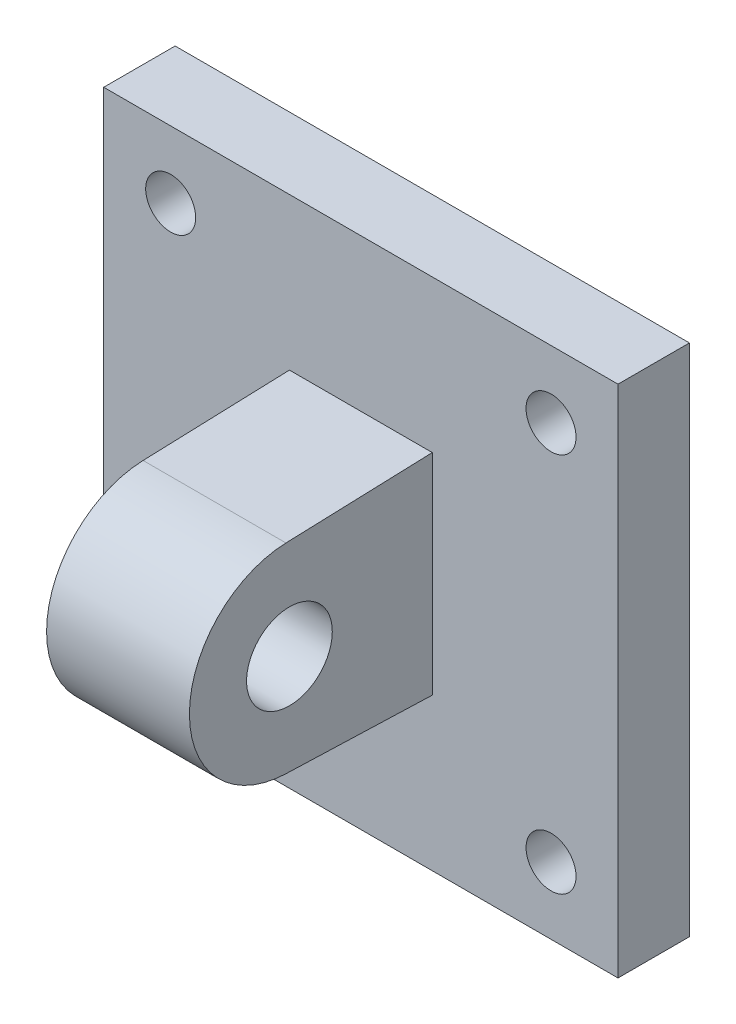
ISO-10303-21;
HEADER;
FILE_DESCRIPTION(('STEP AP214'),'2;1');
FILE_NAME('part.step','',(''),(''),'','','');
FILE_SCHEMA(('AUTOMOTIVE_DESIGN { 1 0 10303 214 1 1 1 1 }'));
ENDSEC;
DATA;
#1=APPLICATION_CONTEXT('core data for automotive mechanical design processes');
#2=APPLICATION_PROTOCOL_DEFINITION('international standard','automotive_design',2000,#1);
#3=PRODUCT_CONTEXT('',#1,'mechanical');
#4=PRODUCT('Part','Part','',(#3));
#5=PRODUCT_RELATED_PRODUCT_CATEGORY('part','',(#4));
#6=PRODUCT_DEFINITION_FORMATION('','',#4);
#7=PRODUCT_DEFINITION_CONTEXT('part definition',#1,'design');
#8=PRODUCT_DEFINITION('design','',#6,#7);
#9=PRODUCT_DEFINITION_SHAPE('','',#8);
#10=(LENGTH_UNIT() NAMED_UNIT(*) SI_UNIT(.MILLI.,.METRE.));
#11=(NAMED_UNIT(*) PLANE_ANGLE_UNIT() SI_UNIT($,.RADIAN.));
#12=(NAMED_UNIT(*) SI_UNIT($,.STERADIAN.) SOLID_ANGLE_UNIT());
#13=UNCERTAINTY_MEASURE_WITH_UNIT(LENGTH_MEASURE(1.E-05),#10,'distance_accuracy_value','');
#14=(GEOMETRIC_REPRESENTATION_CONTEXT(3) GLOBAL_UNCERTAINTY_ASSIGNED_CONTEXT((#13)) GLOBAL_UNIT_ASSIGNED_CONTEXT((#10,
#11,#12)) REPRESENTATION_CONTEXT('',''));
#15=CARTESIAN_POINT('',(0.,0.,0.));
#16=DIRECTION('',(0.,0.,1.));
#17=DIRECTION('',(1.,0.,0.));
#18=AXIS2_PLACEMENT_3D('',#15,#16,#17);
#19=CARTESIAN_POINT('',(-57.15,-57.15,15.875));
#20=DIRECTION('',(0.,0.,1.));
#21=DIRECTION('',(1.,0.,0.));
#22=AXIS2_PLACEMENT_3D('',#19,#20,#21);
#23=PLANE('',#22);
#24=CARTESIAN_POINT('',(-42.2671875,42.2671875,15.875));
#25=DIRECTION('',(0.,0.,1.));
#26=DIRECTION('',(1.,0.,0.));
#27=AXIS2_PLACEMENT_3D('',#24,#25,#26);
#28=CIRCLE('',#27,5.55625);
#29=CARTESIAN_POINT('',(-36.7109375,42.2671875,15.875));
#30=VERTEX_POINT('',#29);
#31=EDGE_CURVE('E143',#30,#30,#28,.T.);
#32=ORIENTED_EDGE('',*,*,#31,.F.);
#33=EDGE_LOOP('',(#32));
#34=FACE_BOUND('',#33,.T.);
#35=CARTESIAN_POINT('',(42.2671875,-42.2671875,15.875));
#36=DIRECTION('',(0.,0.,1.));
#37=DIRECTION('',(1.,0.,0.));
#38=AXIS2_PLACEMENT_3D('',#35,#36,#37);
#39=CIRCLE('',#38,5.55625);
#40=CARTESIAN_POINT('',(47.8234375,-42.2671875,15.875));
#41=VERTEX_POINT('',#40);
#42=EDGE_CURVE('E155',#41,#41,#39,.T.);
#43=ORIENTED_EDGE('',*,*,#42,.F.);
#44=EDGE_LOOP('',(#43));
#45=FACE_BOUND('',#44,.T.);
#46=DIRECTION('',(0.,-1.,0.));
#47=VECTOR('',#46,1.);
#48=CARTESIAN_POINT('',(-57.15,57.15,15.875));
#49=LINE('',#48,#47);
#50=CARTESIAN_POINT('',(-57.15,57.15,15.875));
#51=VERTEX_POINT('',#50);
#52=CARTESIAN_POINT('',(-57.15,-57.15,15.875));
#53=VERTEX_POINT('',#52);
#54=EDGE_CURVE('E167',#51,#53,#49,.T.);
#55=ORIENTED_EDGE('',*,*,#54,.T.);
#56=DIRECTION('',(1.,0.,0.));
#57=VECTOR('',#56,1.);
#58=CARTESIAN_POINT('',(-57.15,-57.15,15.875));
#59=LINE('',#58,#57);
#60=CARTESIAN_POINT('',(57.15,-57.15,15.875));
#61=VERTEX_POINT('',#60);
#62=EDGE_CURVE('E170',#53,#61,#59,.T.);
#63=ORIENTED_EDGE('',*,*,#62,.T.);
#64=DIRECTION('',(0.,1.,0.));
#65=VECTOR('',#64,1.);
#66=CARTESIAN_POINT('',(57.15,-57.15,15.875));
#67=LINE('',#66,#65);
#68=CARTESIAN_POINT('',(57.15,57.15,15.875));
#69=VERTEX_POINT('',#68);
#70=EDGE_CURVE('E173',#61,#69,#67,.T.);
#71=ORIENTED_EDGE('',*,*,#70,.T.);
#72=DIRECTION('',(-1.,0.,0.));
#73=VECTOR('',#72,1.);
#74=CARTESIAN_POINT('',(57.15,57.15,15.875));
#75=LINE('',#74,#73);
#76=EDGE_CURVE('E175',#69,#51,#75,.T.);
#77=ORIENTED_EDGE('',*,*,#76,.T.);
#78=EDGE_LOOP('',(#55,#63,#71,#77));
#79=FACE_BOUND('',#78,.T.);
#80=CARTESIAN_POINT('',(-42.2671875,-42.2671875,15.875));
#81=DIRECTION('',(0.,0.,1.));
#82=DIRECTION('',(1.,0.,0.));
#83=AXIS2_PLACEMENT_3D('',#80,#81,#82);
#84=CIRCLE('',#83,5.55625);
#85=CARTESIAN_POINT('',(-36.7109375,-42.2671875,15.875));
#86=VERTEX_POINT('',#85);
#87=EDGE_CURVE('E161',#86,#86,#84,.T.);
#88=ORIENTED_EDGE('',*,*,#87,.F.);
#89=EDGE_LOOP('',(#88));
#90=FACE_BOUND('',#89,.T.);
#91=CARTESIAN_POINT('',(42.2671875,42.2671875,15.875));
#92=DIRECTION('',(0.,0.,1.));
#93=DIRECTION('',(1.,0.,0.));
#94=AXIS2_PLACEMENT_3D('',#91,#92,#93);
#95=CIRCLE('',#94,5.55625);
#96=CARTESIAN_POINT('',(47.8234375,42.2671875,15.875));
#97=VERTEX_POINT('',#96);
#98=EDGE_CURVE('E149',#97,#97,#95,.T.);
#99=ORIENTED_EDGE('',*,*,#98,.F.);
#100=EDGE_LOOP('',(#99));
#101=FACE_BOUND('',#100,.T.);
#102=DIRECTION('',(1.,0.,0.));
#103=VECTOR('',#102,1.);
#104=CARTESIAN_POINT('',(-15.875,-23.3472815534041,15.875));
#105=LINE('',#104,#103);
#106=CARTESIAN_POINT('',(-15.875,-23.3472815534041,15.875));
#107=VERTEX_POINT('',#106);
#108=CARTESIAN_POINT('',(15.875,-23.3472815534041,15.875));
#109=VERTEX_POINT('',#108);
#110=EDGE_CURVE('E54',#107,#109,#105,.T.);
#111=ORIENTED_EDGE('',*,*,#110,.F.);
#112=DIRECTION('',(0.,1.,0.));
#113=VECTOR('',#112,1.);
#114=CARTESIAN_POINT('',(-15.875,23.3472815534041,15.875));
#115=LINE('',#114,#113);
#116=CARTESIAN_POINT('',(-15.875,23.3472815534041,15.875));
#117=VERTEX_POINT('',#116);
#118=EDGE_CURVE('E49',#107,#117,#115,.T.);
#119=ORIENTED_EDGE('',*,*,#118,.T.);
#120=DIRECTION('',(1.,0.,0.));
#121=VECTOR('',#120,1.);
#122=CARTESIAN_POINT('',(-15.875,23.3472815534041,15.875));
#123=LINE('',#122,#121);
#124=CARTESIAN_POINT('',(15.875,23.3472815534041,15.875));
#125=VERTEX_POINT('',#124);
#126=EDGE_CURVE('E140',#117,#125,#123,.T.);
#127=ORIENTED_EDGE('',*,*,#126,.T.);
#128=DIRECTION('',(0.,1.,0.));
#129=VECTOR('',#128,1.);
#130=CARTESIAN_POINT('',(15.875,23.3472815534041,15.875));
#131=LINE('',#130,#129);
#132=EDGE_CURVE('E114',#109,#125,#131,.T.);
#133=ORIENTED_EDGE('',*,*,#132,.F.);
#134=EDGE_LOOP('',(#111,#119,#127,#133));
#135=FACE_BOUND('',#134,.T.);
#136=ADVANCED_FACE('F34',(#34,#45,#79,#90,#101,#135),#23,.T.);
#137=CARTESIAN_POINT('',(-57.15,-57.15,0.));
#138=DIRECTION('',(0.,0.,1.));
#139=DIRECTION('',(1.,0.,0.));
#140=AXIS2_PLACEMENT_3D('',#137,#138,#139);
#141=PLANE('',#140);
#142=CARTESIAN_POINT('',(42.2671875,42.2671875,0.));
#143=DIRECTION('',(0.,0.,1.));
#144=DIRECTION('',(1.,0.,0.));
#145=AXIS2_PLACEMENT_3D('',#142,#143,#144);
#146=CIRCLE('',#145,5.55625);
#147=CARTESIAN_POINT('',(47.8234375,42.2671875,0.));
#148=VERTEX_POINT('',#147);
#149=EDGE_CURVE('E146',#148,#148,#146,.T.);
#150=ORIENTED_EDGE('',*,*,#149,.T.);
#151=EDGE_LOOP('',(#150));
#152=FACE_BOUND('',#151,.T.);
#153=CARTESIAN_POINT('',(-42.2671875,-42.2671875,0.));
#154=DIRECTION('',(0.,0.,1.));
#155=DIRECTION('',(1.,0.,0.));
#156=AXIS2_PLACEMENT_3D('',#153,#154,#155);
#157=CIRCLE('',#156,5.55625);
#158=CARTESIAN_POINT('',(-36.7109375,-42.2671875,0.));
#159=VERTEX_POINT('',#158);
#160=EDGE_CURVE('E158',#159,#159,#157,.T.);
#161=ORIENTED_EDGE('',*,*,#160,.T.);
#162=EDGE_LOOP('',(#161));
#163=FACE_BOUND('',#162,.T.);
#164=DIRECTION('',(0.,-1.,0.));
#165=VECTOR('',#164,1.);
#166=CARTESIAN_POINT('',(-57.15,57.15,0.));
#167=LINE('',#166,#165);
#168=CARTESIAN_POINT('',(-57.15,57.15,0.));
#169=VERTEX_POINT('',#168);
#170=CARTESIAN_POINT('',(-57.15,-57.15,0.));
#171=VERTEX_POINT('',#170);
#172=EDGE_CURVE('E164',#169,#171,#167,.T.);
#173=ORIENTED_EDGE('',*,*,#172,.F.);
#174=DIRECTION('',(-1.,0.,0.));
#175=VECTOR('',#174,1.);
#176=CARTESIAN_POINT('',(57.15,57.15,0.));
#177=LINE('',#176,#175);
#178=CARTESIAN_POINT('',(57.15,57.15,0.));
#179=VERTEX_POINT('',#178);
#180=EDGE_CURVE('E171',#179,#169,#177,.T.);
#181=ORIENTED_EDGE('',*,*,#180,.F.);
#182=DIRECTION('',(0.,1.,0.));
#183=VECTOR('',#182,1.);
#184=CARTESIAN_POINT('',(57.15,-57.15,0.));
#185=LINE('',#184,#183);
#186=CARTESIAN_POINT('',(57.15,-57.15,0.));
#187=VERTEX_POINT('',#186);
#188=EDGE_CURVE('E182',#187,#179,#185,.T.);
#189=ORIENTED_EDGE('',*,*,#188,.F.);
#190=DIRECTION('',(1.,0.,0.));
#191=VECTOR('',#190,1.);
#192=CARTESIAN_POINT('',(-57.15,-57.15,0.));
#193=LINE('',#192,#191);
#194=EDGE_CURVE('E180',#171,#187,#193,.T.);
#195=ORIENTED_EDGE('',*,*,#194,.F.);
#196=EDGE_LOOP('',(#173,#181,#189,#195));
#197=FACE_BOUND('',#196,.T.);
#198=CARTESIAN_POINT('',(42.2671875,-42.2671875,0.));
#199=DIRECTION('',(0.,0.,1.));
#200=DIRECTION('',(1.,0.,0.));
#201=AXIS2_PLACEMENT_3D('',#198,#199,#200);
#202=CIRCLE('',#201,5.55625);
#203=CARTESIAN_POINT('',(47.8234375,-42.2671875,0.));
#204=VERTEX_POINT('',#203);
#205=EDGE_CURVE('E152',#204,#204,#202,.T.);
#206=ORIENTED_EDGE('',*,*,#205,.T.);
#207=EDGE_LOOP('',(#206));
#208=FACE_BOUND('',#207,.T.);
#209=CARTESIAN_POINT('',(-42.2671875,42.2671875,0.));
#210=DIRECTION('',(0.,0.,1.));
#211=DIRECTION('',(1.,0.,0.));
#212=AXIS2_PLACEMENT_3D('',#209,#210,#211);
#213=CIRCLE('',#212,5.55625);
#214=CARTESIAN_POINT('',(-36.7109375,42.2671875,0.));
#215=VERTEX_POINT('',#214);
#216=EDGE_CURVE('E139',#215,#215,#213,.T.);
#217=ORIENTED_EDGE('',*,*,#216,.T.);
#218=EDGE_LOOP('',(#217));
#219=FACE_BOUND('',#218,.T.);
#220=ADVANCED_FACE('F200',(#152,#163,#197,#208,#219),#141,.F.);
#221=CARTESIAN_POINT('',(-57.15,57.15,15.875));
#222=DIRECTION('',(1.,0.,0.));
#223=DIRECTION('',(0.,1.,0.));
#224=AXIS2_PLACEMENT_3D('',#221,#222,#223);
#225=PLANE('',#224);
#226=ORIENTED_EDGE('',*,*,#172,.T.);
#227=DIRECTION('',(0.,0.,-1.));
#228=VECTOR('',#227,1.);
#229=CARTESIAN_POINT('',(-57.15,-57.15,15.875));
#230=LINE('',#229,#228);
#231=EDGE_CURVE('E11',#53,#171,#230,.T.);
#232=ORIENTED_EDGE('',*,*,#231,.F.);
#233=ORIENTED_EDGE('',*,*,#54,.F.);
#234=DIRECTION('',(0.,0.,-1.));
#235=VECTOR('',#234,1.);
#236=CARTESIAN_POINT('',(-57.15,57.15,15.875));
#237=LINE('',#236,#235);
#238=EDGE_CURVE('E177',#51,#169,#237,.T.);
#239=ORIENTED_EDGE('',*,*,#238,.T.);
#240=EDGE_LOOP('',(#226,#232,#233,#239));
#241=FACE_BOUND('',#240,.T.);
#242=ADVANCED_FACE('F36',(#241),#225,.F.);
#243=CARTESIAN_POINT('',(-57.15,-57.15,15.875));
#244=DIRECTION('',(0.,1.,0.));
#245=DIRECTION('',(0.,0.,1.));
#246=AXIS2_PLACEMENT_3D('',#243,#244,#245);
#247=PLANE('',#246);
#248=ORIENTED_EDGE('',*,*,#194,.T.);
#249=DIRECTION('',(0.,0.,-1.));
#250=VECTOR('',#249,1.);
#251=CARTESIAN_POINT('',(57.15,-57.15,15.875));
#252=LINE('',#251,#250);
#253=EDGE_CURVE('E42',#61,#187,#252,.T.);
#254=ORIENTED_EDGE('',*,*,#253,.F.);
#255=ORIENTED_EDGE('',*,*,#62,.F.);
#256=ORIENTED_EDGE('',*,*,#231,.T.);
#257=EDGE_LOOP('',(#248,#254,#255,#256));
#258=FACE_BOUND('',#257,.T.);
#259=ADVANCED_FACE('F211',(#258),#247,.F.);
#260=CARTESIAN_POINT('',(57.15,-57.15,15.875));
#261=DIRECTION('',(-1.,0.,0.));
#262=DIRECTION('',(0.,-1.,0.));
#263=AXIS2_PLACEMENT_3D('',#260,#261,#262);
#264=PLANE('',#263);
#265=ORIENTED_EDGE('',*,*,#188,.T.);
#266=DIRECTION('',(0.,0.,-1.));
#267=VECTOR('',#266,1.);
#268=CARTESIAN_POINT('',(57.15,57.15,15.875));
#269=LINE('',#268,#267);
#270=EDGE_CURVE('E187',#69,#179,#269,.T.);
#271=ORIENTED_EDGE('',*,*,#270,.F.);
#272=ORIENTED_EDGE('',*,*,#70,.F.);
#273=ORIENTED_EDGE('',*,*,#253,.T.);
#274=EDGE_LOOP('',(#265,#271,#272,#273));
#275=FACE_BOUND('',#274,.T.);
#276=ADVANCED_FACE('F194',(#275),#264,.F.);
#277=CARTESIAN_POINT('',(57.15,57.15,15.875));
#278=DIRECTION('',(0.,-1.,0.));
#279=DIRECTION('',(0.,0.,-1.));
#280=AXIS2_PLACEMENT_3D('',#277,#278,#279);
#281=PLANE('',#280);
#282=ORIENTED_EDGE('',*,*,#180,.T.);
#283=ORIENTED_EDGE('',*,*,#238,.F.);
#284=ORIENTED_EDGE('',*,*,#76,.F.);
#285=ORIENTED_EDGE('',*,*,#270,.T.);
#286=EDGE_LOOP('',(#282,#283,#284,#285));
#287=FACE_BOUND('',#286,.T.);
#288=ADVANCED_FACE('F204',(#287),#281,.F.);
#289=CARTESIAN_POINT('',(-42.2671875,-42.2671875,15.875));
#290=DIRECTION('',(0.,0.,-1.));
#291=DIRECTION('',(-1.,0.,0.));
#292=AXIS2_PLACEMENT_3D('',#289,#290,#291);
#293=CYLINDRICAL_SURFACE('',#292,5.55625);
#294=ORIENTED_EDGE('',*,*,#87,.T.);
#295=EDGE_LOOP('',(#294));
#296=FACE_BOUND('',#295,.T.);
#297=ORIENTED_EDGE('',*,*,#160,.F.);
#298=EDGE_LOOP('',(#297));
#299=FACE_BOUND('',#298,.T.);
#300=ADVANCED_FACE('F229',(#296,#299),#293,.F.);
#301=CARTESIAN_POINT('',(42.2671875,-42.2671875,15.875));
#302=DIRECTION('',(0.,0.,-1.));
#303=DIRECTION('',(-1.,0.,0.));
#304=AXIS2_PLACEMENT_3D('',#301,#302,#303);
#305=CYLINDRICAL_SURFACE('',#304,5.55625);
#306=ORIENTED_EDGE('',*,*,#42,.T.);
#307=EDGE_LOOP('',(#306));
#308=FACE_BOUND('',#307,.T.);
#309=ORIENTED_EDGE('',*,*,#205,.F.);
#310=EDGE_LOOP('',(#309));
#311=FACE_BOUND('',#310,.T.);
#312=ADVANCED_FACE('F236',(#308,#311),#305,.F.);
#313=CARTESIAN_POINT('',(42.2671875,42.2671875,15.875));
#314=DIRECTION('',(0.,0.,-1.));
#315=DIRECTION('',(-1.,0.,0.));
#316=AXIS2_PLACEMENT_3D('',#313,#314,#315);
#317=CYLINDRICAL_SURFACE('',#316,5.55625);
#318=ORIENTED_EDGE('',*,*,#98,.T.);
#319=EDGE_LOOP('',(#318));
#320=FACE_BOUND('',#319,.T.);
#321=ORIENTED_EDGE('',*,*,#149,.F.);
#322=EDGE_LOOP('',(#321));
#323=FACE_BOUND('',#322,.T.);
#324=ADVANCED_FACE('F241',(#320,#323),#317,.F.);
#325=CARTESIAN_POINT('',(-42.2671875,42.2671875,15.875));
#326=DIRECTION('',(0.,0.,-1.));
#327=DIRECTION('',(-1.,0.,0.));
#328=AXIS2_PLACEMENT_3D('',#325,#326,#327);
#329=CYLINDRICAL_SURFACE('',#328,5.55625);
#330=ORIENTED_EDGE('',*,*,#31,.T.);
#331=EDGE_LOOP('',(#330));
#332=FACE_BOUND('',#331,.T.);
#333=ORIENTED_EDGE('',*,*,#216,.F.);
#334=EDGE_LOOP('',(#333));
#335=FACE_BOUND('',#334,.T.);
#336=ADVANCED_FACE('F252',(#332,#335),#329,.F.);
#337=CARTESIAN_POINT('',(-15.875,0.,47.625));
#338=DIRECTION('',(1.,0.,0.));
#339=DIRECTION('',(0.,0.,-1.));
#340=AXIS2_PLACEMENT_3D('',#337,#338,#339);
#341=CYLINDRICAL_SURFACE('',#340,22.225);
#342=DIRECTION('',(1.,0.,0.));
#343=VECTOR('',#342,1.);
#344=CARTESIAN_POINT('',(-15.875,-22.2114611304994,48.4006413142129));
#345=LINE('',#344,#343);
#346=CARTESIAN_POINT('',(-15.875,-22.2114611304994,48.4006413142129));
#347=VERTEX_POINT('',#346);
#348=CARTESIAN_POINT('',(15.875,-22.2114611304994,48.4006413142129));
#349=VERTEX_POINT('',#348);
#350=EDGE_CURVE('E97',#347,#349,#345,.T.);
#351=ORIENTED_EDGE('',*,*,#350,.T.);
#352=CARTESIAN_POINT('',(15.875,0.,47.625));
#353=DIRECTION('',(1.,0.,0.));
#354=DIRECTION('',(0.,0.,-1.));
#355=AXIS2_PLACEMENT_3D('',#352,#353,#354);
#356=CIRCLE('',#355,22.225);
#357=CARTESIAN_POINT('',(15.875,22.2114611304994,48.4006413142129));
#358=VERTEX_POINT('',#357);
#359=EDGE_CURVE('E101',#358,#349,#356,.T.);
#360=ORIENTED_EDGE('',*,*,#359,.F.);
#361=DIRECTION('',(1.,0.,0.));
#362=VECTOR('',#361,1.);
#363=CARTESIAN_POINT('',(-15.875,22.2114611304994,48.4006413142129));
#364=LINE('',#363,#362);
#365=CARTESIAN_POINT('',(-15.875,22.2114611304994,48.4006413142129));
#366=VERTEX_POINT('',#365);
#367=EDGE_CURVE('E137',#366,#358,#364,.T.);
#368=ORIENTED_EDGE('',*,*,#367,.F.);
#369=CARTESIAN_POINT('',(-15.875,0.,47.625));
#370=DIRECTION('',(1.,0.,0.));
#371=DIRECTION('',(0.,0.,-1.));
#372=AXIS2_PLACEMENT_3D('',#369,#370,#371);
#373=CIRCLE('',#372,22.225);
#374=EDGE_CURVE('E103',#366,#347,#373,.T.);
#375=ORIENTED_EDGE('',*,*,#374,.T.);
#376=EDGE_LOOP('',(#351,#360,#368,#375));
#377=FACE_BOUND('',#376,.T.);
#378=ADVANCED_FACE('F99',(#377),#341,.T.);
#379=CARTESIAN_POINT('',(-15.875,22.2114611304994,48.4006413142129));
#380=DIRECTION('',(0.,0.999390827019096,0.0348994967024942));
#381=DIRECTION('',(0.,-0.0348994967024942,0.999390827019096));
#382=AXIS2_PLACEMENT_3D('',#379,#380,#381);
#383=PLANE('',#382);
#384=ORIENTED_EDGE('',*,*,#367,.T.);
#385=DIRECTION('',(0.,-0.0348994967024942,0.999390827019096));
#386=VECTOR('',#385,1.);
#387=CARTESIAN_POINT('',(15.875,22.2114611304994,48.4006413142129));
#388=LINE('',#387,#386);
#389=EDGE_CURVE('E120',#125,#358,#388,.T.);
#390=ORIENTED_EDGE('',*,*,#389,.F.);
#391=ORIENTED_EDGE('',*,*,#126,.F.);
#392=DIRECTION('',(0.,-0.0348994967024942,0.999390827019096));
#393=VECTOR('',#392,1.);
#394=CARTESIAN_POINT('',(-15.875,22.2114611304994,48.4006413142129));
#395=LINE('',#394,#393);
#396=EDGE_CURVE('E107',#117,#366,#395,.T.);
#397=ORIENTED_EDGE('',*,*,#396,.T.);
#398=EDGE_LOOP('',(#384,#390,#391,#397));
#399=FACE_BOUND('',#398,.T.);
#400=ADVANCED_FACE('F263',(#399),#383,.T.);
#401=CARTESIAN_POINT('',(-15.875,-22.2114611304994,48.4006413142129));
#402=DIRECTION('',(0.,-0.999390827019096,0.0348994967024942));
#403=DIRECTION('',(0.,-0.0348994967024942,-0.999390827019096));
#404=AXIS2_PLACEMENT_3D('',#401,#402,#403);
#405=PLANE('',#404);
#406=ORIENTED_EDGE('',*,*,#110,.T.);
#407=DIRECTION('',(0.,-0.0348994967024942,-0.999390827019096));
#408=VECTOR('',#407,1.);
#409=CARTESIAN_POINT('',(15.875,-22.2114611304994,48.4006413142129));
#410=LINE('',#409,#408);
#411=EDGE_CURVE('E110',#349,#109,#410,.T.);
#412=ORIENTED_EDGE('',*,*,#411,.F.);
#413=ORIENTED_EDGE('',*,*,#350,.F.);
#414=DIRECTION('',(0.,-0.0348994967024942,-0.999390827019096));
#415=VECTOR('',#414,1.);
#416=CARTESIAN_POINT('',(-15.875,-22.2114611304994,48.4006413142129));
#417=LINE('',#416,#415);
#418=EDGE_CURVE('E132',#347,#107,#417,.T.);
#419=ORIENTED_EDGE('',*,*,#418,.T.);
#420=EDGE_LOOP('',(#406,#412,#413,#419));
#421=FACE_BOUND('',#420,.T.);
#422=ADVANCED_FACE('F111',(#421),#405,.T.);
#423=CARTESIAN_POINT('',(-15.875,0.,47.625));
#424=DIRECTION('',(1.,0.,0.));
#425=DIRECTION('',(0.,0.,-1.));
#426=AXIS2_PLACEMENT_3D('',#423,#424,#425);
#427=PLANE('',#426);
#428=CARTESIAN_POINT('',(-15.875,0.,47.625));
#429=DIRECTION('',(1.,0.,0.));
#430=DIRECTION('',(0.,0.,-1.));
#431=AXIS2_PLACEMENT_3D('',#428,#429,#430);
#432=CIRCLE('',#431,9.525);
#433=CARTESIAN_POINT('',(-15.875,0.,38.1));
#434=VERTEX_POINT('',#433);
#435=EDGE_CURVE('E128',#434,#434,#432,.T.);
#436=ORIENTED_EDGE('',*,*,#435,.T.);
#437=EDGE_LOOP('',(#436));
#438=FACE_BOUND('',#437,.T.);
#439=ORIENTED_EDGE('',*,*,#374,.F.);
#440=ORIENTED_EDGE('',*,*,#396,.F.);
#441=ORIENTED_EDGE('',*,*,#118,.F.);
#442=ORIENTED_EDGE('',*,*,#418,.F.);
#443=EDGE_LOOP('',(#439,#440,#441,#442));
#444=FACE_BOUND('',#443,.T.);
#445=ADVANCED_FACE('F266',(#438,#444),#427,.F.);
#446=CARTESIAN_POINT('',(-15.875,0.,47.625));
#447=DIRECTION('',(1.,0.,0.));
#448=DIRECTION('',(0.,0.,-1.));
#449=AXIS2_PLACEMENT_3D('',#446,#447,#448);
#450=CYLINDRICAL_SURFACE('',#449,9.525);
#451=ORIENTED_EDGE('',*,*,#435,.F.);
#452=EDGE_LOOP('',(#451));
#453=FACE_BOUND('',#452,.T.);
#454=CARTESIAN_POINT('',(15.875,0.,47.625));
#455=DIRECTION('',(1.,0.,0.));
#456=DIRECTION('',(0.,0.,-1.));
#457=AXIS2_PLACEMENT_3D('',#454,#455,#456);
#458=CIRCLE('',#457,9.525);
#459=CARTESIAN_POINT('',(15.875,0.,38.1));
#460=VERTEX_POINT('',#459);
#461=EDGE_CURVE('E121',#460,#460,#458,.T.);
#462=ORIENTED_EDGE('',*,*,#461,.T.);
#463=EDGE_LOOP('',(#462));
#464=FACE_BOUND('',#463,.T.);
#465=ADVANCED_FACE('F272',(#453,#464),#450,.F.);
#466=CARTESIAN_POINT('',(15.875,0.,47.625));
#467=DIRECTION('',(1.,0.,0.));
#468=DIRECTION('',(0.,0.,-1.));
#469=AXIS2_PLACEMENT_3D('',#466,#467,#468);
#470=PLANE('',#469);
#471=ORIENTED_EDGE('',*,*,#359,.T.);
#472=ORIENTED_EDGE('',*,*,#411,.T.);
#473=ORIENTED_EDGE('',*,*,#132,.T.);
#474=ORIENTED_EDGE('',*,*,#389,.T.);
#475=EDGE_LOOP('',(#471,#472,#473,#474));
#476=FACE_BOUND('',#475,.T.);
#477=ORIENTED_EDGE('',*,*,#461,.F.);
#478=EDGE_LOOP('',(#477));
#479=FACE_BOUND('',#478,.T.);
#480=ADVANCED_FACE('F117',(#476,#479),#470,.T.);
#481=CLOSED_SHELL('',(#136,#220,#242,#259,#276,#288,#300,#312,#324,#336,#378,#400,#422,#445,
#465,#480));
#482=MANIFOLD_SOLID_BREP('B2',#481);
#483=ADVANCED_BREP_SHAPE_REPRESENTATION('',(#18,#482),#14);
#484=SHAPE_DEFINITION_REPRESENTATION(#9,#483);
ENDSEC;
END-ISO-10303-21;
